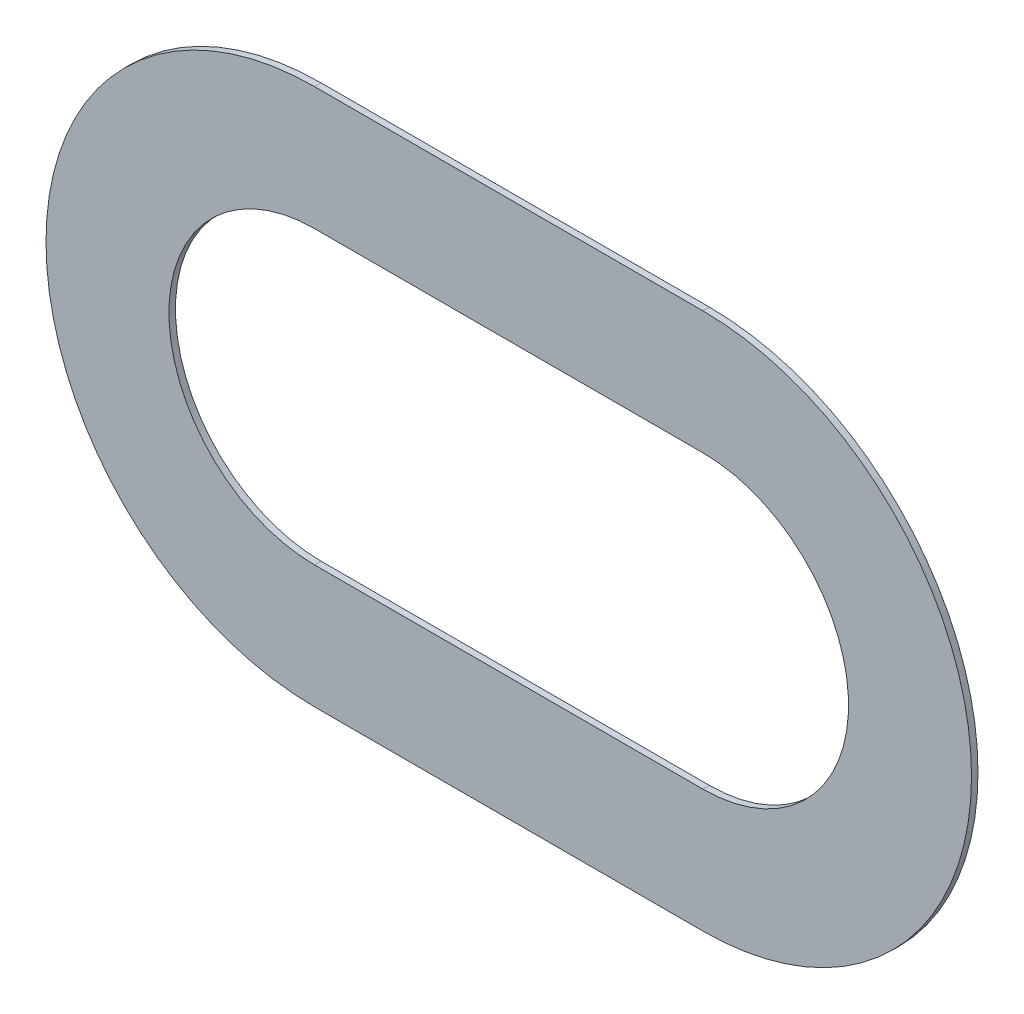
ISO-10303-21;
HEADER;
FILE_DESCRIPTION(('STEP AP214'),'2;1');
FILE_NAME('part.step','',(''),(''),'','','');
FILE_SCHEMA(('AUTOMOTIVE_DESIGN { 1 0 10303 214 1 1 1 1 }'));
ENDSEC;
DATA;
#1=APPLICATION_CONTEXT('core data for automotive mechanical design processes');
#2=APPLICATION_PROTOCOL_DEFINITION('international standard','automotive_design',2000,#1);
#3=PRODUCT_CONTEXT('',#1,'mechanical');
#4=PRODUCT('Part','Part','',(#3));
#5=PRODUCT_RELATED_PRODUCT_CATEGORY('part','',(#4));
#6=PRODUCT_DEFINITION_FORMATION('','',#4);
#7=PRODUCT_DEFINITION_CONTEXT('part definition',#1,'design');
#8=PRODUCT_DEFINITION('design','',#6,#7);
#9=PRODUCT_DEFINITION_SHAPE('','',#8);
#10=(LENGTH_UNIT() NAMED_UNIT(*) SI_UNIT(.MILLI.,.METRE.));
#11=(NAMED_UNIT(*) PLANE_ANGLE_UNIT() SI_UNIT($,.RADIAN.));
#12=(NAMED_UNIT(*) SI_UNIT($,.STERADIAN.) SOLID_ANGLE_UNIT());
#13=UNCERTAINTY_MEASURE_WITH_UNIT(LENGTH_MEASURE(1.E-05),#10,'distance_accuracy_value','');
#14=(GEOMETRIC_REPRESENTATION_CONTEXT(3) GLOBAL_UNCERTAINTY_ASSIGNED_CONTEXT((#13)) GLOBAL_UNIT_ASSIGNED_CONTEXT((#10,
#11,#12)) REPRESENTATION_CONTEXT('',''));
#15=CARTESIAN_POINT('',(0.,0.,0.));
#16=DIRECTION('',(0.,0.,1.));
#17=DIRECTION('',(1.,0.,0.));
#18=AXIS2_PLACEMENT_3D('',#15,#16,#17);
#19=CARTESIAN_POINT('',(0.,0.,0.0962));
#20=DIRECTION('',(0.,0.,1.));
#21=DIRECTION('',(1.,0.,0.));
#22=AXIS2_PLACEMENT_3D('',#19,#20,#21);
#23=PLANE('',#22);
#24=CARTESIAN_POINT('',(-0.885,7.25,0.0962));
#25=DIRECTION('',(0.,0.,1.));
#26=DIRECTION('',(1.,0.,0.));
#27=AXIS2_PLACEMENT_3D('',#24,#25,#26);
#28=CIRCLE('',#27,0.45);
#29=CARTESIAN_POINT('',(-0.885,7.7,0.0962));
#30=VERTEX_POINT('',#29);
#31=CARTESIAN_POINT('',(-0.885,6.8,0.0962));
#32=VERTEX_POINT('',#31);
#33=EDGE_CURVE('E137',#30,#32,#28,.F.);
#34=ORIENTED_EDGE('',*,*,#33,.T.);
#35=DIRECTION('',(1.,0.,0.));
#36=VECTOR('',#35,1.);
#37=CARTESIAN_POINT('',(-0.885,6.8,0.0962));
#38=LINE('',#37,#36);
#39=CARTESIAN_POINT('',(-2.085,6.8,0.0962));
#40=VERTEX_POINT('',#39);
#41=EDGE_CURVE('E108',#40,#32,#38,.T.);
#42=ORIENTED_EDGE('',*,*,#41,.F.);
#43=CARTESIAN_POINT('',(-2.085,7.25,0.0962));
#44=DIRECTION('',(0.,0.,1.));
#45=DIRECTION('',(1.,0.,0.));
#46=AXIS2_PLACEMENT_3D('',#43,#44,#45);
#47=CIRCLE('',#46,0.45);
#48=CARTESIAN_POINT('',(-2.085,7.7,0.0962));
#49=VERTEX_POINT('',#48);
#50=EDGE_CURVE('E115',#40,#49,#47,.F.);
#51=ORIENTED_EDGE('',*,*,#50,.T.);
#52=DIRECTION('',(1.,0.,0.));
#53=VECTOR('',#52,1.);
#54=CARTESIAN_POINT('',(-2.085,7.7,0.0962));
#55=LINE('',#54,#53);
#56=EDGE_CURVE('E112',#30,#49,#55,.F.);
#57=ORIENTED_EDGE('',*,*,#56,.F.);
#58=EDGE_LOOP('',(#34,#42,#51,#57));
#59=FACE_BOUND('',#58,.T.);
#60=DIRECTION('',(1.,0.,0.));
#61=VECTOR('',#60,1.);
#62=CARTESIAN_POINT('',(-2.085,6.42,0.0962));
#63=LINE('',#62,#61);
#64=CARTESIAN_POINT('',(-0.885,6.42,0.0962));
#65=VERTEX_POINT('',#64);
#66=CARTESIAN_POINT('',(-2.085,6.42,0.0962));
#67=VERTEX_POINT('',#66);
#68=EDGE_CURVE('E78',#65,#67,#63,.F.);
#69=ORIENTED_EDGE('',*,*,#68,.F.);
#70=CARTESIAN_POINT('',(-0.885,7.25,0.0962));
#71=DIRECTION('',(0.,0.,1.));
#72=DIRECTION('',(1.,0.,0.));
#73=AXIS2_PLACEMENT_3D('',#70,#71,#72);
#74=CIRCLE('',#73,0.83);
#75=CARTESIAN_POINT('',(-0.885,8.08,0.0962));
#76=VERTEX_POINT('',#75);
#77=EDGE_CURVE('E94',#76,#65,#74,.F.);
#78=ORIENTED_EDGE('',*,*,#77,.F.);
#79=DIRECTION('',(1.,0.,0.));
#80=VECTOR('',#79,1.);
#81=CARTESIAN_POINT('',(-0.885,8.08,0.0962));
#82=LINE('',#81,#80);
#83=CARTESIAN_POINT('',(-2.085,8.08,0.0962));
#84=VERTEX_POINT('',#83);
#85=EDGE_CURVE('E92',#84,#76,#82,.T.);
#86=ORIENTED_EDGE('',*,*,#85,.F.);
#87=CARTESIAN_POINT('',(-2.085,7.25,0.0962));
#88=DIRECTION('',(0.,0.,1.));
#89=DIRECTION('',(1.,0.,0.));
#90=AXIS2_PLACEMENT_3D('',#87,#88,#89);
#91=CIRCLE('',#90,0.83);
#92=EDGE_CURVE('E20',#67,#84,#91,.F.);
#93=ORIENTED_EDGE('',*,*,#92,.F.);
#94=EDGE_LOOP('',(#69,#78,#86,#93));
#95=FACE_BOUND('',#94,.T.);
#96=ADVANCED_FACE('F17',(#59,#95),#23,.T.);
#97=CARTESIAN_POINT('',(-2.085,6.42,0.0762));
#98=DIRECTION('',(0.,-1.,0.));
#99=DIRECTION('',(0.,0.,-1.));
#100=AXIS2_PLACEMENT_3D('',#97,#98,#99);
#101=PLANE('',#100);
#102=DIRECTION('',(0.,0.,1.));
#103=VECTOR('',#102,1.);
#104=CARTESIAN_POINT('',(-2.085,6.42,0.0762));
#105=LINE('',#104,#103);
#106=CARTESIAN_POINT('',(-2.085,6.42,0.07615128101));
#107=VERTEX_POINT('',#106);
#108=EDGE_CURVE('E89',#107,#67,#105,.T.);
#109=ORIENTED_EDGE('',*,*,#108,.F.);
#110=DIRECTION('',(-1.,0.,0.));
#111=VECTOR('',#110,1.);
#112=CARTESIAN_POINT('',(5.860697562431,6.42,0.07615128101));
#113=LINE('',#112,#111);
#114=CARTESIAN_POINT('',(-0.885,6.42,0.07615128101));
#115=VERTEX_POINT('',#114);
#116=EDGE_CURVE('E132',#115,#107,#113,.T.);
#117=ORIENTED_EDGE('',*,*,#116,.F.);
#118=DIRECTION('',(0.,0.,1.));
#119=VECTOR('',#118,1.);
#120=CARTESIAN_POINT('',(-0.885,6.42,0.0762));
#121=LINE('',#120,#119);
#122=EDGE_CURVE('E138',#65,#115,#121,.F.);
#123=ORIENTED_EDGE('',*,*,#122,.F.);
#124=ORIENTED_EDGE('',*,*,#68,.T.);
#125=EDGE_LOOP('',(#109,#117,#123,#124));
#126=FACE_BOUND('',#125,.T.);
#127=ADVANCED_FACE('F145',(#126),#101,.T.);
#128=CARTESIAN_POINT('',(-2.085,7.25,0.0762));
#129=DIRECTION('',(0.,0.,1.));
#130=DIRECTION('',(1.,0.,0.));
#131=AXIS2_PLACEMENT_3D('',#128,#129,#130);
#132=CYLINDRICAL_SURFACE('',#131,0.83);
#133=DIRECTION('',(0.,0.,1.));
#134=VECTOR('',#133,1.);
#135=CARTESIAN_POINT('',(-2.085,8.08,0.0762));
#136=LINE('',#135,#134);
#137=CARTESIAN_POINT('',(-2.085,8.08,0.07615128101));
#138=VERTEX_POINT('',#137);
#139=EDGE_CURVE('E87',#138,#84,#136,.T.);
#140=ORIENTED_EDGE('',*,*,#139,.F.);
#141=CARTESIAN_POINT('',(-2.085,7.25,0.07615128101));
#142=DIRECTION('',(0.,0.,-1.));
#143=DIRECTION('',(-1.,0.,0.));
#144=AXIS2_PLACEMENT_3D('',#141,#142,#143);
#145=CIRCLE('',#144,0.83);
#146=EDGE_CURVE('E130',#107,#138,#145,.T.);
#147=ORIENTED_EDGE('',*,*,#146,.F.);
#148=ORIENTED_EDGE('',*,*,#108,.T.);
#149=ORIENTED_EDGE('',*,*,#92,.T.);
#150=EDGE_LOOP('',(#140,#147,#148,#149));
#151=FACE_BOUND('',#150,.T.);
#152=ADVANCED_FACE('F84',(#151),#132,.T.);
#153=CARTESIAN_POINT('',(-0.885,8.08,0.0762));
#154=DIRECTION('',(0.,1.,0.));
#155=DIRECTION('',(0.,0.,1.));
#156=AXIS2_PLACEMENT_3D('',#153,#154,#155);
#157=PLANE('',#156);
#158=DIRECTION('',(0.,0.,1.));
#159=VECTOR('',#158,1.);
#160=CARTESIAN_POINT('',(-0.885,8.08,0.0762));
#161=LINE('',#160,#159);
#162=CARTESIAN_POINT('',(-0.885,8.08,0.07615128101));
#163=VERTEX_POINT('',#162);
#164=EDGE_CURVE('E97',#163,#76,#161,.T.);
#165=ORIENTED_EDGE('',*,*,#164,.F.);
#166=DIRECTION('',(-1.,0.,0.));
#167=VECTOR('',#166,1.);
#168=CARTESIAN_POINT('',(5.860697562431,8.08,0.07615128101));
#169=LINE('',#168,#167);
#170=EDGE_CURVE('E101',#138,#163,#169,.F.);
#171=ORIENTED_EDGE('',*,*,#170,.F.);
#172=ORIENTED_EDGE('',*,*,#139,.T.);
#173=ORIENTED_EDGE('',*,*,#85,.T.);
#174=EDGE_LOOP('',(#165,#171,#172,#173));
#175=FACE_BOUND('',#174,.T.);
#176=ADVANCED_FACE('F99',(#175),#157,.T.);
#177=CARTESIAN_POINT('',(-0.885,7.25,0.0762));
#178=DIRECTION('',(0.,0.,1.));
#179=DIRECTION('',(1.,0.,0.));
#180=AXIS2_PLACEMENT_3D('',#177,#178,#179);
#181=CYLINDRICAL_SURFACE('',#180,0.83);
#182=ORIENTED_EDGE('',*,*,#122,.T.);
#183=CARTESIAN_POINT('',(-0.885,7.25,0.07615128101));
#184=DIRECTION('',(0.,0.,-1.));
#185=DIRECTION('',(-1.,0.,0.));
#186=AXIS2_PLACEMENT_3D('',#183,#184,#185);
#187=CIRCLE('',#186,0.83);
#188=EDGE_CURVE('E126',#163,#115,#187,.T.);
#189=ORIENTED_EDGE('',*,*,#188,.F.);
#190=ORIENTED_EDGE('',*,*,#164,.T.);
#191=ORIENTED_EDGE('',*,*,#77,.T.);
#192=EDGE_LOOP('',(#182,#189,#190,#191));
#193=FACE_BOUND('',#192,.T.);
#194=ADVANCED_FACE('F142',(#193),#181,.T.);
#195=CARTESIAN_POINT('',(-0.885,7.25,0.0762));
#196=DIRECTION('',(0.,0.,1.));
#197=DIRECTION('',(1.,0.,0.));
#198=AXIS2_PLACEMENT_3D('',#195,#196,#197);
#199=CYLINDRICAL_SURFACE('',#198,0.45);
#200=ORIENTED_EDGE('',*,*,#33,.F.);
#201=DIRECTION('',(0.,0.,-1.));
#202=VECTOR('',#201,1.);
#203=CARTESIAN_POINT('',(-0.885,7.7,0.0762));
#204=LINE('',#203,#202);
#205=CARTESIAN_POINT('',(-0.885,7.7,0.07615128101));
#206=VERTEX_POINT('',#205);
#207=EDGE_CURVE('E116',#206,#30,#204,.F.);
#208=ORIENTED_EDGE('',*,*,#207,.F.);
#209=CARTESIAN_POINT('',(-0.885,7.25,0.07615128101));
#210=DIRECTION('',(0.,0.,-1.));
#211=DIRECTION('',(-1.,0.,0.));
#212=AXIS2_PLACEMENT_3D('',#209,#210,#211);
#213=CIRCLE('',#212,0.45);
#214=CARTESIAN_POINT('',(-0.885,6.8,0.07615128101));
#215=VERTEX_POINT('',#214);
#216=EDGE_CURVE('E123',#215,#206,#213,.F.);
#217=ORIENTED_EDGE('',*,*,#216,.F.);
#218=DIRECTION('',(0.,0.,1.));
#219=VECTOR('',#218,1.);
#220=CARTESIAN_POINT('',(-0.885,6.8,0.0762));
#221=LINE('',#220,#219);
#222=EDGE_CURVE('E111',#32,#215,#221,.F.);
#223=ORIENTED_EDGE('',*,*,#222,.F.);
#224=EDGE_LOOP('',(#200,#208,#217,#223));
#225=FACE_BOUND('',#224,.T.);
#226=ADVANCED_FACE('F170',(#225),#199,.F.);
#227=CARTESIAN_POINT('',(-2.085,7.7,0.0762));
#228=DIRECTION('',(0.,-1.,0.));
#229=DIRECTION('',(0.,0.,-1.));
#230=AXIS2_PLACEMENT_3D('',#227,#228,#229);
#231=PLANE('',#230);
#232=DIRECTION('',(0.,0.,1.));
#233=VECTOR('',#232,1.);
#234=CARTESIAN_POINT('',(-2.085,7.7,0.0762));
#235=LINE('',#234,#233);
#236=CARTESIAN_POINT('',(-2.085,7.7,0.07615128101));
#237=VERTEX_POINT('',#236);
#238=EDGE_CURVE('E136',#49,#237,#235,.F.);
#239=ORIENTED_EDGE('',*,*,#238,.T.);
#240=DIRECTION('',(-1.,0.,0.));
#241=VECTOR('',#240,1.);
#242=CARTESIAN_POINT('',(5.860697562431,7.7,0.07615128101));
#243=LINE('',#242,#241);
#244=EDGE_CURVE('E120',#206,#237,#243,.T.);
#245=ORIENTED_EDGE('',*,*,#244,.F.);
#246=ORIENTED_EDGE('',*,*,#207,.T.);
#247=ORIENTED_EDGE('',*,*,#56,.T.);
#248=EDGE_LOOP('',(#239,#245,#246,#247));
#249=FACE_BOUND('',#248,.T.);
#250=ADVANCED_FACE('F167',(#249),#231,.T.);
#251=CARTESIAN_POINT('',(-2.085,7.25,0.0762));
#252=DIRECTION('',(0.,0.,1.));
#253=DIRECTION('',(1.,0.,0.));
#254=AXIS2_PLACEMENT_3D('',#251,#252,#253);
#255=CYLINDRICAL_SURFACE('',#254,0.45);
#256=ORIENTED_EDGE('',*,*,#50,.F.);
#257=DIRECTION('',(0.,0.,1.));
#258=VECTOR('',#257,1.);
#259=CARTESIAN_POINT('',(-2.085,6.8,0.0762));
#260=LINE('',#259,#258);
#261=CARTESIAN_POINT('',(-2.085,6.8,0.07615128101));
#262=VERTEX_POINT('',#261);
#263=EDGE_CURVE('E35',#262,#40,#260,.T.);
#264=ORIENTED_EDGE('',*,*,#263,.F.);
#265=CARTESIAN_POINT('',(-2.085,7.25,0.07615128101));
#266=DIRECTION('',(0.,0.,-1.));
#267=DIRECTION('',(-1.,0.,0.));
#268=AXIS2_PLACEMENT_3D('',#265,#266,#267);
#269=CIRCLE('',#268,0.45);
#270=EDGE_CURVE('E26',#237,#262,#269,.F.);
#271=ORIENTED_EDGE('',*,*,#270,.F.);
#272=ORIENTED_EDGE('',*,*,#238,.F.);
#273=EDGE_LOOP('',(#256,#264,#271,#272));
#274=FACE_BOUND('',#273,.T.);
#275=ADVANCED_FACE('F161',(#274),#255,.F.);
#276=CARTESIAN_POINT('',(-0.885,6.8,0.0762));
#277=DIRECTION('',(0.,1.,0.));
#278=DIRECTION('',(0.,0.,1.));
#279=AXIS2_PLACEMENT_3D('',#276,#277,#278);
#280=PLANE('',#279);
#281=ORIENTED_EDGE('',*,*,#222,.T.);
#282=DIRECTION('',(-1.,0.,0.));
#283=VECTOR('',#282,1.);
#284=CARTESIAN_POINT('',(5.860697562431,6.8,0.07615128101));
#285=LINE('',#284,#283);
#286=EDGE_CURVE('E11',#262,#215,#285,.F.);
#287=ORIENTED_EDGE('',*,*,#286,.F.);
#288=ORIENTED_EDGE('',*,*,#263,.T.);
#289=ORIENTED_EDGE('',*,*,#41,.T.);
#290=EDGE_LOOP('',(#281,#287,#288,#289));
#291=FACE_BOUND('',#290,.T.);
#292=ADVANCED_FACE('F155',(#291),#280,.T.);
#293=CARTESIAN_POINT('',(5.860697562431,-4.,0.07615128101));
#294=DIRECTION('',(0.,0.,-1.));
#295=DIRECTION('',(-1.,0.,0.));
#296=AXIS2_PLACEMENT_3D('',#293,#294,#295);
#297=PLANE('',#296);
#298=ORIENTED_EDGE('',*,*,#270,.T.);
#299=ORIENTED_EDGE('',*,*,#286,.T.);
#300=ORIENTED_EDGE('',*,*,#216,.T.);
#301=ORIENTED_EDGE('',*,*,#244,.T.);
#302=EDGE_LOOP('',(#298,#299,#300,#301));
#303=FACE_BOUND('',#302,.T.);
#304=ORIENTED_EDGE('',*,*,#170,.T.);
#305=ORIENTED_EDGE('',*,*,#188,.T.);
#306=ORIENTED_EDGE('',*,*,#116,.T.);
#307=ORIENTED_EDGE('',*,*,#146,.T.);
#308=EDGE_LOOP('',(#304,#305,#306,#307));
#309=FACE_BOUND('',#308,.T.);
#310=ADVANCED_FACE('F144',(#303,#309),#297,.T.);
#311=CLOSED_SHELL('',(#96,#127,#152,#176,#194,#226,#250,#275,#292,#310));
#312=MANIFOLD_SOLID_BREP('B1',#311);
#313=ADVANCED_BREP_SHAPE_REPRESENTATION('',(#18,#312),#14);
#314=SHAPE_DEFINITION_REPRESENTATION(#9,#313);
ENDSEC;
END-ISO-10303-21;
